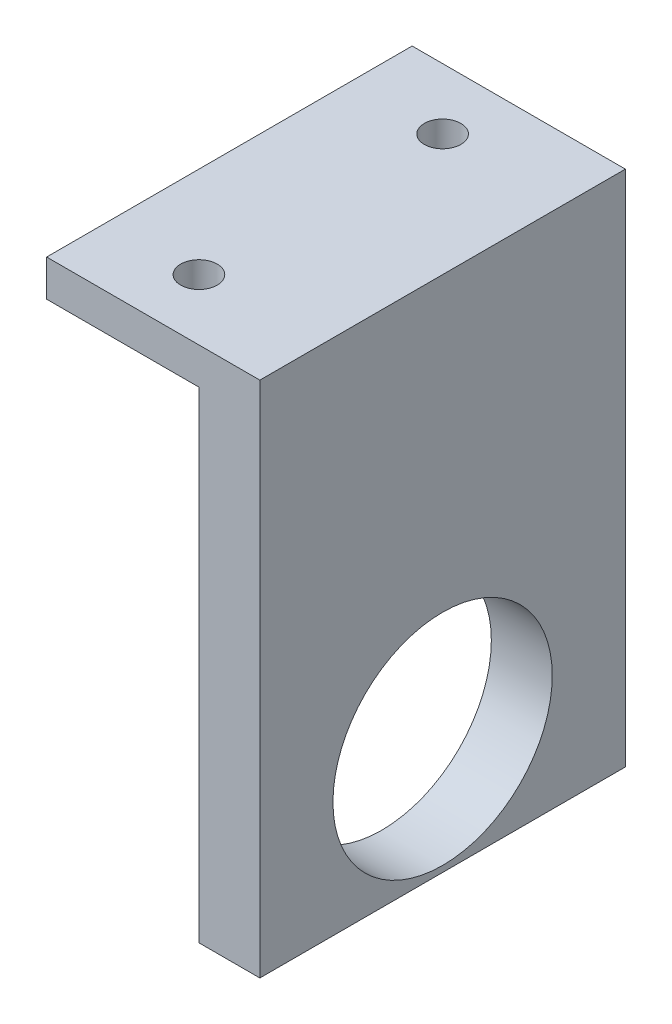
ISO-10303-21;
HEADER;
FILE_DESCRIPTION(('STEP AP214'),'2;1');
FILE_NAME('part.step','',(''),(''),'','','');
FILE_SCHEMA(('AUTOMOTIVE_DESIGN { 1 0 10303 214 1 1 1 1 }'));
ENDSEC;
DATA;
#1=APPLICATION_CONTEXT('core data for automotive mechanical design processes');
#2=APPLICATION_PROTOCOL_DEFINITION('international standard','automotive_design',2000,#1);
#3=PRODUCT_CONTEXT('',#1,'mechanical');
#4=PRODUCT('Part','Part','',(#3));
#5=PRODUCT_RELATED_PRODUCT_CATEGORY('part','',(#4));
#6=PRODUCT_DEFINITION_FORMATION('','',#4);
#7=PRODUCT_DEFINITION_CONTEXT('part definition',#1,'design');
#8=PRODUCT_DEFINITION('design','',#6,#7);
#9=PRODUCT_DEFINITION_SHAPE('','',#8);
#10=(LENGTH_UNIT() NAMED_UNIT(*) SI_UNIT(.MILLI.,.METRE.));
#11=(NAMED_UNIT(*) PLANE_ANGLE_UNIT() SI_UNIT($,.RADIAN.));
#12=(NAMED_UNIT(*) SI_UNIT($,.STERADIAN.) SOLID_ANGLE_UNIT());
#13=UNCERTAINTY_MEASURE_WITH_UNIT(LENGTH_MEASURE(1.E-05),#10,'distance_accuracy_value','');
#14=(GEOMETRIC_REPRESENTATION_CONTEXT(3) GLOBAL_UNCERTAINTY_ASSIGNED_CONTEXT((#13)) GLOBAL_UNIT_ASSIGNED_CONTEXT((#10,
#11,#12)) REPRESENTATION_CONTEXT('',''));
#15=CARTESIAN_POINT('',(0.,0.,0.));
#16=DIRECTION('',(0.,0.,1.));
#17=DIRECTION('',(1.,0.,0.));
#18=AXIS2_PLACEMENT_3D('',#15,#16,#17);
#19=CARTESIAN_POINT('',(5.,-28.5,15.));
#20=DIRECTION('',(0.,0.,1.));
#21=DIRECTION('',(1.,0.,0.));
#22=AXIS2_PLACEMENT_3D('',#19,#20,#21);
#23=PLANE('',#22);
#24=DIRECTION('',(0.,1.,0.));
#25=VECTOR('',#24,1.);
#26=CARTESIAN_POINT('',(0.,-28.5,15.));
#27=LINE('',#26,#25);
#28=CARTESIAN_POINT('',(0.,-28.5,15.));
#29=VERTEX_POINT('',#28);
#30=CARTESIAN_POINT('',(0.,11.0000000000001,15.));
#31=VERTEX_POINT('',#30);
#32=EDGE_CURVE('E79',#29,#31,#27,.T.);
#33=ORIENTED_EDGE('',*,*,#32,.F.);
#34=DIRECTION('',(-1.,0.,0.));
#35=VECTOR('',#34,1.);
#36=CARTESIAN_POINT('',(5.,-28.5,15.));
#37=LINE('',#36,#35);
#38=CARTESIAN_POINT('',(5.,-28.5,15.));
#39=VERTEX_POINT('',#38);
#40=EDGE_CURVE('E11',#39,#29,#37,.T.);
#41=ORIENTED_EDGE('',*,*,#40,.F.);
#42=DIRECTION('',(0.,1.,0.));
#43=VECTOR('',#42,1.);
#44=CARTESIAN_POINT('',(5.,-28.5,15.));
#45=LINE('',#44,#43);
#46=CARTESIAN_POINT('',(5.,14.0000000000001,15.));
#47=VERTEX_POINT('',#46);
#48=EDGE_CURVE('E82',#39,#47,#45,.T.);
#49=ORIENTED_EDGE('',*,*,#48,.T.);
#50=DIRECTION('',(1.,0.,0.));
#51=VECTOR('',#50,1.);
#52=CARTESIAN_POINT('',(5.,14.0000000000001,15.));
#53=LINE('',#52,#51);
#54=CARTESIAN_POINT('',(-12.5,14.0000000000001,15.));
#55=VERTEX_POINT('',#54);
#56=EDGE_CURVE('E141',#55,#47,#53,.T.);
#57=ORIENTED_EDGE('',*,*,#56,.F.);
#58=DIRECTION('',(0.,-1.,0.));
#59=VECTOR('',#58,1.);
#60=CARTESIAN_POINT('',(-12.5,14.0000000000001,15.));
#61=LINE('',#60,#59);
#62=CARTESIAN_POINT('',(-12.5,11.0000000000001,15.));
#63=VERTEX_POINT('',#62);
#64=EDGE_CURVE('E151',#55,#63,#61,.T.);
#65=ORIENTED_EDGE('',*,*,#64,.T.);
#66=DIRECTION('',(1.,0.,0.));
#67=VECTOR('',#66,1.);
#68=CARTESIAN_POINT('',(5.,11.0000000000001,15.));
#69=LINE('',#68,#67);
#70=EDGE_CURVE('E87',#63,#31,#69,.T.);
#71=ORIENTED_EDGE('',*,*,#70,.T.);
#72=EDGE_LOOP('',(#33,#41,#49,#57,#65,#71));
#73=FACE_BOUND('',#72,.T.);
#74=ADVANCED_FACE('F41',(#73),#23,.T.);
#75=CARTESIAN_POINT('',(5.,-28.5,15.));
#76=DIRECTION('',(0.,1.,0.));
#77=DIRECTION('',(0.,0.,1.));
#78=AXIS2_PLACEMENT_3D('',#75,#76,#77);
#79=PLANE('',#78);
#80=DIRECTION('',(0.,0.,-1.));
#81=VECTOR('',#80,1.);
#82=CARTESIAN_POINT('',(0.,-28.5,15.));
#83=LINE('',#82,#81);
#84=CARTESIAN_POINT('',(0.,-28.5,-15.));
#85=VERTEX_POINT('',#84);
#86=EDGE_CURVE('E69',#29,#85,#83,.T.);
#87=ORIENTED_EDGE('',*,*,#86,.T.);
#88=DIRECTION('',(-1.,0.,0.));
#89=VECTOR('',#88,1.);
#90=CARTESIAN_POINT('',(5.,-28.5,-15.));
#91=LINE('',#90,#89);
#92=CARTESIAN_POINT('',(5.,-28.5,-15.));
#93=VERTEX_POINT('',#92);
#94=EDGE_CURVE('E44',#93,#85,#91,.T.);
#95=ORIENTED_EDGE('',*,*,#94,.F.);
#96=DIRECTION('',(0.,0.,-1.));
#97=VECTOR('',#96,1.);
#98=CARTESIAN_POINT('',(5.,-28.5,15.));
#99=LINE('',#98,#97);
#100=EDGE_CURVE('E72',#39,#93,#99,.T.);
#101=ORIENTED_EDGE('',*,*,#100,.F.);
#102=ORIENTED_EDGE('',*,*,#40,.T.);
#103=EDGE_LOOP('',(#87,#95,#101,#102));
#104=FACE_BOUND('',#103,.T.);
#105=ADVANCED_FACE('F71',(#104),#79,.F.);
#106=CARTESIAN_POINT('',(5.,-28.5,-15.));
#107=DIRECTION('',(0.,0.,1.));
#108=DIRECTION('',(1.,0.,0.));
#109=AXIS2_PLACEMENT_3D('',#106,#107,#108);
#110=PLANE('',#109);
#111=DIRECTION('',(0.,1.,0.));
#112=VECTOR('',#111,1.);
#113=CARTESIAN_POINT('',(0.,-28.5,-15.));
#114=LINE('',#113,#112);
#115=CARTESIAN_POINT('',(0.,11.,-15.));
#116=VERTEX_POINT('',#115);
#117=EDGE_CURVE('E81',#85,#116,#114,.T.);
#118=ORIENTED_EDGE('',*,*,#117,.T.);
#119=DIRECTION('',(-1.,0.,0.));
#120=VECTOR('',#119,1.);
#121=CARTESIAN_POINT('',(5.,10.9999999999999,-15.));
#122=LINE('',#121,#120);
#123=CARTESIAN_POINT('',(-12.5,10.9999999999999,-15.));
#124=VERTEX_POINT('',#123);
#125=EDGE_CURVE('E103',#116,#124,#122,.T.);
#126=ORIENTED_EDGE('',*,*,#125,.T.);
#127=DIRECTION('',(0.,-1.,0.));
#128=VECTOR('',#127,1.);
#129=CARTESIAN_POINT('',(-12.5,13.9999999999999,-15.));
#130=LINE('',#129,#128);
#131=CARTESIAN_POINT('',(-12.5,13.9999999999999,-15.));
#132=VERTEX_POINT('',#131);
#133=EDGE_CURVE('E133',#132,#124,#130,.T.);
#134=ORIENTED_EDGE('',*,*,#133,.F.);
#135=DIRECTION('',(-1.,0.,0.));
#136=VECTOR('',#135,1.);
#137=CARTESIAN_POINT('',(5.,13.9999999999999,-15.));
#138=LINE('',#137,#136);
#139=CARTESIAN_POINT('',(5.,13.9999999999999,-15.));
#140=VERTEX_POINT('',#139);
#141=EDGE_CURVE('E132',#140,#132,#138,.T.);
#142=ORIENTED_EDGE('',*,*,#141,.F.);
#143=DIRECTION('',(0.,1.,0.));
#144=VECTOR('',#143,1.);
#145=CARTESIAN_POINT('',(5.,-28.5,-15.));
#146=LINE('',#145,#144);
#147=EDGE_CURVE('E127',#93,#140,#146,.T.);
#148=ORIENTED_EDGE('',*,*,#147,.F.);
#149=ORIENTED_EDGE('',*,*,#94,.T.);
#150=EDGE_LOOP('',(#118,#126,#134,#142,#148,#149));
#151=FACE_BOUND('',#150,.T.);
#152=ADVANCED_FACE('F100',(#151),#110,.F.);
#153=CARTESIAN_POINT('',(5.,0.,0.));
#154=DIRECTION('',(-1.,0.,0.));
#155=DIRECTION('',(0.,0.,1.));
#156=AXIS2_PLACEMENT_3D('',#153,#154,#155);
#157=PLANE('',#156);
#158=CARTESIAN_POINT('',(5.00000000000011,-19.,0.));
#159=DIRECTION('',(1.,0.,0.));
#160=DIRECTION('',(0.,1.,0.));
#161=AXIS2_PLACEMENT_3D('',#158,#159,#160);
#162=CIRCLE('',#161,9.);
#163=CARTESIAN_POINT('',(5.00000000000005,-9.99999999999997,0.));
#164=VERTEX_POINT('',#163);
#165=EDGE_CURVE('E93',#164,#164,#162,.T.);
#166=ORIENTED_EDGE('',*,*,#165,.F.);
#167=EDGE_LOOP('',(#166));
#168=FACE_BOUND('',#167,.T.);
#169=ORIENTED_EDGE('',*,*,#48,.F.);
#170=ORIENTED_EDGE('',*,*,#100,.T.);
#171=ORIENTED_EDGE('',*,*,#147,.T.);
#172=DIRECTION('',(0.,0.,-1.));
#173=VECTOR('',#172,1.);
#174=CARTESIAN_POINT('',(5.,13.9999999999999,-15.));
#175=LINE('',#174,#173);
#176=EDGE_CURVE('E131',#47,#140,#175,.T.);
#177=ORIENTED_EDGE('',*,*,#176,.F.);
#178=EDGE_LOOP('',(#169,#170,#171,#177));
#179=FACE_BOUND('',#178,.T.);
#180=ADVANCED_FACE('F129',(#168,#179),#157,.F.);
#181=CARTESIAN_POINT('',(0.,0.,0.));
#182=DIRECTION('',(-1.,0.,0.));
#183=DIRECTION('',(0.,0.,1.));
#184=AXIS2_PLACEMENT_3D('',#181,#182,#183);
#185=PLANE('',#184);
#186=CARTESIAN_POINT('',(1.13624387676481E-13,-19.,0.));
#187=DIRECTION('',(1.,0.,0.));
#188=DIRECTION('',(0.,1.,0.));
#189=AXIS2_PLACEMENT_3D('',#186,#187,#188);
#190=CIRCLE('',#189,9.);
#191=CARTESIAN_POINT('',(0.,-10.,0.));
#192=VERTEX_POINT('',#191);
#193=EDGE_CURVE('E89',#192,#192,#190,.T.);
#194=ORIENTED_EDGE('',*,*,#193,.T.);
#195=EDGE_LOOP('',(#194));
#196=FACE_BOUND('',#195,.T.);
#197=ORIENTED_EDGE('',*,*,#32,.T.);
#198=DIRECTION('',(0.,0.,-1.));
#199=VECTOR('',#198,1.);
#200=CARTESIAN_POINT('',(0.,11.,15.));
#201=LINE('',#200,#199);
#202=EDGE_CURVE('E88',#31,#116,#201,.T.);
#203=ORIENTED_EDGE('',*,*,#202,.T.);
#204=ORIENTED_EDGE('',*,*,#117,.F.);
#205=ORIENTED_EDGE('',*,*,#86,.F.);
#206=EDGE_LOOP('',(#197,#203,#204,#205));
#207=FACE_BOUND('',#206,.T.);
#208=ADVANCED_FACE('F77',(#196,#207),#185,.T.);
#209=CARTESIAN_POINT('',(1.13624387676481E-13,-19.,0.));
#210=DIRECTION('',(1.,0.,0.));
#211=DIRECTION('',(0.,1.,0.));
#212=AXIS2_PLACEMENT_3D('',#209,#210,#211);
#213=CYLINDRICAL_SURFACE('',#212,9.);
#214=ORIENTED_EDGE('',*,*,#193,.F.);
#215=EDGE_LOOP('',(#214));
#216=FACE_BOUND('',#215,.T.);
#217=ORIENTED_EDGE('',*,*,#165,.T.);
#218=EDGE_LOOP('',(#217));
#219=FACE_BOUND('',#218,.T.);
#220=ADVANCED_FACE('F171',(#216,#219),#213,.F.);
#221=CARTESIAN_POINT('',(0.,11.,0.));
#222=DIRECTION('',(0.,-1.,0.));
#223=DIRECTION('',(0.,0.,-1.));
#224=AXIS2_PLACEMENT_3D('',#221,#222,#223);
#225=PLANE('',#224);
#226=CARTESIAN_POINT('',(-4.99999999999998,10.9999999999999,-9.99999999999998));
#227=DIRECTION('',(0.,1.,0.));
#228=DIRECTION('',(0.,0.,1.));
#229=AXIS2_PLACEMENT_3D('',#226,#227,#228);
#230=CIRCLE('',#229,1.5);
#231=CARTESIAN_POINT('',(-4.99999999999998,10.9999999999999,-8.49999999999998));
#232=VERTEX_POINT('',#231);
#233=EDGE_CURVE('E153',#232,#232,#230,.T.);
#234=ORIENTED_EDGE('',*,*,#233,.T.);
#235=EDGE_LOOP('',(#234));
#236=FACE_BOUND('',#235,.T.);
#237=CARTESIAN_POINT('',(-5.00000000000002,11.0000000000001,10.));
#238=DIRECTION('',(0.,1.,0.));
#239=DIRECTION('',(0.,0.,1.));
#240=AXIS2_PLACEMENT_3D('',#237,#238,#239);
#241=CIRCLE('',#240,1.5);
#242=CARTESIAN_POINT('',(-5.00000000000002,11.0000000000002,11.5));
#243=VERTEX_POINT('',#242);
#244=EDGE_CURVE('E146',#243,#243,#241,.T.);
#245=ORIENTED_EDGE('',*,*,#244,.T.);
#246=EDGE_LOOP('',(#245));
#247=FACE_BOUND('',#246,.T.);
#248=ORIENTED_EDGE('',*,*,#202,.F.);
#249=ORIENTED_EDGE('',*,*,#70,.F.);
#250=DIRECTION('',(0.,0.,1.));
#251=VECTOR('',#250,1.);
#252=CARTESIAN_POINT('',(-12.5,10.9999999999999,-15.));
#253=LINE('',#252,#251);
#254=EDGE_CURVE('E143',#124,#63,#253,.T.);
#255=ORIENTED_EDGE('',*,*,#254,.F.);
#256=ORIENTED_EDGE('',*,*,#125,.F.);
#257=EDGE_LOOP('',(#248,#249,#255,#256));
#258=FACE_BOUND('',#257,.T.);
#259=ADVANCED_FACE('F108',(#236,#247,#258),#225,.T.);
#260=CARTESIAN_POINT('',(-12.5,13.9999999999999,-15.));
#261=DIRECTION('',(1.,0.,0.));
#262=DIRECTION('',(0.,0.,-1.));
#263=AXIS2_PLACEMENT_3D('',#260,#261,#262);
#264=PLANE('',#263);
#265=ORIENTED_EDGE('',*,*,#254,.T.);
#266=ORIENTED_EDGE('',*,*,#64,.F.);
#267=DIRECTION('',(0.,0.,1.));
#268=VECTOR('',#267,1.);
#269=CARTESIAN_POINT('',(-12.5,13.9999999999999,-15.));
#270=LINE('',#269,#268);
#271=EDGE_CURVE('E136',#132,#55,#270,.T.);
#272=ORIENTED_EDGE('',*,*,#271,.F.);
#273=ORIENTED_EDGE('',*,*,#133,.T.);
#274=EDGE_LOOP('',(#265,#266,#272,#273));
#275=FACE_BOUND('',#274,.T.);
#276=ADVANCED_FACE('F161',(#275),#264,.F.);
#277=CARTESIAN_POINT('',(0.,14.,0.));
#278=DIRECTION('',(0.,-1.,0.));
#279=DIRECTION('',(0.,0.,-1.));
#280=AXIS2_PLACEMENT_3D('',#277,#278,#279);
#281=PLANE('',#280);
#282=CARTESIAN_POINT('',(-4.99999999999998,13.9999999999999,-10.));
#283=DIRECTION('',(0.,1.,0.));
#284=DIRECTION('',(0.,0.,1.));
#285=AXIS2_PLACEMENT_3D('',#282,#283,#284);
#286=CIRCLE('',#285,1.5);
#287=CARTESIAN_POINT('',(-4.99999999999998,13.9999999999999,-8.50000000000002));
#288=VERTEX_POINT('',#287);
#289=EDGE_CURVE('E297',#288,#288,#286,.T.);
#290=ORIENTED_EDGE('',*,*,#289,.F.);
#291=EDGE_LOOP('',(#290));
#292=FACE_BOUND('',#291,.T.);
#293=CARTESIAN_POINT('',(-5.00000000000002,14.0000000000001,9.99999999999998));
#294=DIRECTION('',(0.,1.,0.));
#295=DIRECTION('',(0.,0.,1.));
#296=AXIS2_PLACEMENT_3D('',#293,#294,#295);
#297=CIRCLE('',#296,1.5);
#298=CARTESIAN_POINT('',(-5.00000000000002,14.0000000000002,11.5));
#299=VERTEX_POINT('',#298);
#300=EDGE_CURVE('E298',#299,#299,#297,.T.);
#301=ORIENTED_EDGE('',*,*,#300,.F.);
#302=EDGE_LOOP('',(#301));
#303=FACE_BOUND('',#302,.T.);
#304=ORIENTED_EDGE('',*,*,#176,.T.);
#305=ORIENTED_EDGE('',*,*,#141,.T.);
#306=ORIENTED_EDGE('',*,*,#271,.T.);
#307=ORIENTED_EDGE('',*,*,#56,.T.);
#308=EDGE_LOOP('',(#304,#305,#306,#307));
#309=FACE_BOUND('',#308,.T.);
#310=ADVANCED_FACE('F139',(#292,#303,#309),#281,.F.);
#311=CARTESIAN_POINT('',(-5.00000000000002,11.0000000000001,10.));
#312=DIRECTION('',(0.,1.,0.));
#313=DIRECTION('',(0.,0.,1.));
#314=AXIS2_PLACEMENT_3D('',#311,#312,#313);
#315=CYLINDRICAL_SURFACE('',#314,1.5);
#316=ORIENTED_EDGE('',*,*,#244,.F.);
#317=EDGE_LOOP('',(#316));
#318=FACE_BOUND('',#317,.T.);
#319=ORIENTED_EDGE('',*,*,#300,.T.);
#320=EDGE_LOOP('',(#319));
#321=FACE_BOUND('',#320,.T.);
#322=ADVANCED_FACE('F168',(#318,#321),#315,.F.);
#323=CARTESIAN_POINT('',(-4.99999999999998,10.9999999999999,-9.99999999999998));
#324=DIRECTION('',(0.,1.,0.));
#325=DIRECTION('',(0.,0.,1.));
#326=AXIS2_PLACEMENT_3D('',#323,#324,#325);
#327=CYLINDRICAL_SURFACE('',#326,1.5);
#328=ORIENTED_EDGE('',*,*,#233,.F.);
#329=EDGE_LOOP('',(#328));
#330=FACE_BOUND('',#329,.T.);
#331=ORIENTED_EDGE('',*,*,#289,.T.);
#332=EDGE_LOOP('',(#331));
#333=FACE_BOUND('',#332,.T.);
#334=ADVANCED_FACE('F222',(#330,#333),#327,.F.);
#335=CLOSED_SHELL('',(#74,#105,#152,#180,#208,#220,#259,#276,#310,#322,#334));
#336=MANIFOLD_SOLID_BREP('B2',#335);
#337=ADVANCED_BREP_SHAPE_REPRESENTATION('',(#18,#336),#14);
#338=SHAPE_DEFINITION_REPRESENTATION(#9,#337);
ENDSEC;
END-ISO-10303-21;
